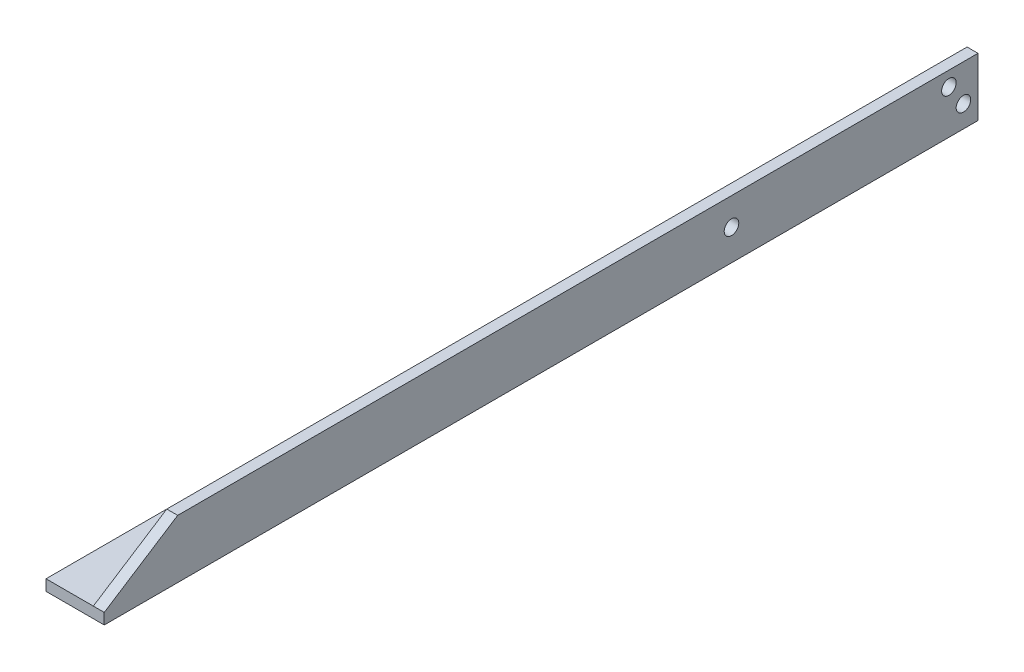
ISO-10303-21;
HEADER;
FILE_DESCRIPTION(('STEP AP214'),'2;1');
FILE_NAME('part.step','',(''),(''),'','','');
FILE_SCHEMA(('AUTOMOTIVE_DESIGN { 1 0 10303 214 1 1 1 1 }'));
ENDSEC;
DATA;
#1=APPLICATION_CONTEXT('core data for automotive mechanical design processes');
#2=APPLICATION_PROTOCOL_DEFINITION('international standard','automotive_design',2000,#1);
#3=PRODUCT_CONTEXT('',#1,'mechanical');
#4=PRODUCT('Part','Part','',(#3));
#5=PRODUCT_RELATED_PRODUCT_CATEGORY('part','',(#4));
#6=PRODUCT_DEFINITION_FORMATION('','',#4);
#7=PRODUCT_DEFINITION_CONTEXT('part definition',#1,'design');
#8=PRODUCT_DEFINITION('design','',#6,#7);
#9=PRODUCT_DEFINITION_SHAPE('','',#8);
#10=(LENGTH_UNIT() NAMED_UNIT(*) SI_UNIT(.MILLI.,.METRE.));
#11=(NAMED_UNIT(*) PLANE_ANGLE_UNIT() SI_UNIT($,.RADIAN.));
#12=(NAMED_UNIT(*) SI_UNIT($,.STERADIAN.) SOLID_ANGLE_UNIT());
#13=UNCERTAINTY_MEASURE_WITH_UNIT(LENGTH_MEASURE(1.E-05),#10,'distance_accuracy_value','');
#14=(GEOMETRIC_REPRESENTATION_CONTEXT(3) GLOBAL_UNCERTAINTY_ASSIGNED_CONTEXT((#13)) GLOBAL_UNIT_ASSIGNED_CONTEXT((#10,
#11,#12)) REPRESENTATION_CONTEXT('',''));
#15=CARTESIAN_POINT('',(0.,0.,0.));
#16=DIRECTION('',(0.,0.,1.));
#17=DIRECTION('',(1.,0.,0.));
#18=AXIS2_PLACEMENT_3D('',#15,#16,#17);
#19=CARTESIAN_POINT('',(-4.7625,0.,381.));
#20=DIRECTION('',(0.,-1.,0.));
#21=DIRECTION('',(1.,0.,0.));
#22=AXIS2_PLACEMENT_3D('',#19,#20,#21);
#23=PLANE('',#22);
#24=DIRECTION('',(0.,0.,-1.));
#25=VECTOR('',#24,1.);
#26=CARTESIAN_POINT('',(-4.7625,0.,381.));
#27=LINE('',#26,#25);
#28=CARTESIAN_POINT('',(-4.76250000000011,0.,348.973392409592));
#29=VERTEX_POINT('',#28);
#30=CARTESIAN_POINT('',(-4.7625,0.,0.));
#31=VERTEX_POINT('',#30);
#32=EDGE_CURVE('E41',#29,#31,#27,.T.);
#33=ORIENTED_EDGE('',*,*,#32,.F.);
#34=DIRECTION('',(1.,0.,0.));
#35=VECTOR('',#34,1.);
#36=CARTESIAN_POINT('',(-483.12448375289,0.,348.973392409592));
#37=LINE('',#36,#35);
#38=CARTESIAN_POINT('',(-1.11022302462516E-13,0.,348.973392409592));
#39=VERTEX_POINT('',#38);
#40=EDGE_CURVE('E96',#29,#39,#37,.T.);
#41=ORIENTED_EDGE('',*,*,#40,.T.);
#42=DIRECTION('',(0.,0.,-1.));
#43=VECTOR('',#42,1.);
#44=CARTESIAN_POINT('',(0.,0.,381.));
#45=LINE('',#44,#43);
#46=CARTESIAN_POINT('',(0.,0.,0.));
#47=VERTEX_POINT('',#46);
#48=EDGE_CURVE('E80',#39,#47,#45,.T.);
#49=ORIENTED_EDGE('',*,*,#48,.T.);
#50=DIRECTION('',(-1.,0.,0.));
#51=VECTOR('',#50,1.);
#52=CARTESIAN_POINT('',(-4.7625,0.,0.));
#53=LINE('',#52,#51);
#54=EDGE_CURVE('E110',#47,#31,#53,.T.);
#55=ORIENTED_EDGE('',*,*,#54,.T.);
#56=EDGE_LOOP('',(#33,#41,#49,#55));
#57=FACE_BOUND('',#56,.T.);
#58=ADVANCED_FACE('F33',(#57),#23,.F.);
#59=CARTESIAN_POINT('',(-4.7625,0.,381.));
#60=DIRECTION('',(1.,0.,0.));
#61=DIRECTION('',(0.,1.,0.));
#62=AXIS2_PLACEMENT_3D('',#59,#60,#61);
#63=PLANE('',#62);
#64=CARTESIAN_POINT('',(-4.7625,-11.9296158183976,107.49070151336));
#65=DIRECTION('',(1.,0.,0.));
#66=DIRECTION('',(0.,1.,0.));
#67=AXIS2_PLACEMENT_3D('',#64,#65,#66);
#68=CIRCLE('',#67,3.17499999999997);
#69=CARTESIAN_POINT('',(-4.7625,-8.7546158183976,107.49070151336));
#70=VERTEX_POINT('',#69);
#71=EDGE_CURVE('E152',#70,#70,#68,.F.);
#72=ORIENTED_EDGE('',*,*,#71,.F.);
#73=EDGE_LOOP('',(#72));
#74=FACE_BOUND('',#73,.T.);
#75=CARTESIAN_POINT('',(-4.7625,-6.35,12.7));
#76=DIRECTION('',(-1.,0.,0.));
#77=DIRECTION('',(0.,0.,1.));
#78=AXIS2_PLACEMENT_3D('',#75,#76,#77);
#79=CIRCLE('',#78,3.175);
#80=CARTESIAN_POINT('',(-4.7625,-6.35,15.875));
#81=VERTEX_POINT('',#80);
#82=EDGE_CURVE('E149',#81,#81,#79,.T.);
#83=ORIENTED_EDGE('',*,*,#82,.F.);
#84=EDGE_LOOP('',(#83));
#85=FACE_BOUND('',#84,.T.);
#86=CARTESIAN_POINT('',(-4.7625,-15.875,6.35));
#87=DIRECTION('',(-1.,0.,0.));
#88=DIRECTION('',(0.,0.,1.));
#89=AXIS2_PLACEMENT_3D('',#86,#87,#88);
#90=CIRCLE('',#89,3.175);
#91=CARTESIAN_POINT('',(-4.7625,-15.875,9.525));
#92=VERTEX_POINT('',#91);
#93=EDGE_CURVE('E143',#92,#92,#90,.T.);
#94=ORIENTED_EDGE('',*,*,#93,.F.);
#95=EDGE_LOOP('',(#94));
#96=FACE_BOUND('',#95,.T.);
#97=DIRECTION('',(0.,0.,-1.));
#98=VECTOR('',#97,1.);
#99=CARTESIAN_POINT('',(-4.7625,-20.6375,381.));
#100=LINE('',#99,#98);
#101=CARTESIAN_POINT('',(-4.7625,-20.6375,381.));
#102=VERTEX_POINT('',#101);
#103=CARTESIAN_POINT('',(-4.7625,-20.6375,0.));
#104=VERTEX_POINT('',#103);
#105=EDGE_CURVE('E108',#102,#104,#100,.T.);
#106=ORIENTED_EDGE('',*,*,#105,.F.);
#107=DIRECTION('',(0.,0.541666666666667,-0.840593375076334));
#108=VECTOR('',#107,1.);
#109=CARTESIAN_POINT('',(-4.7625,-14.5824001736111,371.603304370175));
#110=LINE('',#109,#108);
#111=EDGE_CURVE('E88',#102,#29,#110,.T.);
#112=ORIENTED_EDGE('',*,*,#111,.T.);
#113=ORIENTED_EDGE('',*,*,#32,.T.);
#114=DIRECTION('',(0.,-1.,0.));
#115=VECTOR('',#114,1.);
#116=CARTESIAN_POINT('',(-4.7625,0.,0.));
#117=LINE('',#116,#115);
#118=EDGE_CURVE('E132',#31,#104,#117,.T.);
#119=ORIENTED_EDGE('',*,*,#118,.T.);
#120=EDGE_LOOP('',(#106,#112,#113,#119));
#121=FACE_BOUND('',#120,.T.);
#122=ADVANCED_FACE('F105',(#74,#85,#96,#121),#63,.F.);
#123=CARTESIAN_POINT('',(-4.7625,-20.6375,381.));
#124=DIRECTION('',(0.,-1.,0.));
#125=DIRECTION('',(1.,0.,0.));
#126=AXIS2_PLACEMENT_3D('',#123,#124,#125);
#127=PLANE('',#126);
#128=CARTESIAN_POINT('',(-15.08125,-20.6375,12.7));
#129=DIRECTION('',(0.,1.,0.));
#130=DIRECTION('',(-1.,0.,0.));
#131=AXIS2_PLACEMENT_3D('',#128,#129,#130);
#132=CIRCLE('',#131,3.175);
#133=CARTESIAN_POINT('',(-18.25625,-20.6375,12.7));
#134=VERTEX_POINT('',#133);
#135=EDGE_CURVE('E161',#134,#134,#132,.T.);
#136=ORIENTED_EDGE('',*,*,#135,.F.);
#137=EDGE_LOOP('',(#136));
#138=FACE_BOUND('',#137,.T.);
#139=DIRECTION('',(-1.,0.,0.));
#140=VECTOR('',#139,1.);
#141=CARTESIAN_POINT('',(-4.7625,-20.6375,0.));
#142=LINE('',#141,#140);
#143=CARTESIAN_POINT('',(-25.4,-20.6375,0.));
#144=VERTEX_POINT('',#143);
#145=EDGE_CURVE('E130',#104,#144,#142,.T.);
#146=ORIENTED_EDGE('',*,*,#145,.T.);
#147=DIRECTION('',(0.,0.,-1.));
#148=VECTOR('',#147,1.);
#149=CARTESIAN_POINT('',(-25.4,-20.6375,381.));
#150=LINE('',#149,#148);
#151=CARTESIAN_POINT('',(-25.4,-20.6375,381.));
#152=VERTEX_POINT('',#151);
#153=EDGE_CURVE('E113',#152,#144,#150,.T.);
#154=ORIENTED_EDGE('',*,*,#153,.F.);
#155=DIRECTION('',(-1.,0.,0.));
#156=VECTOR('',#155,1.);
#157=CARTESIAN_POINT('',(-4.7625,-20.6375,381.));
#158=LINE('',#157,#156);
#159=EDGE_CURVE('E126',#102,#152,#158,.T.);
#160=ORIENTED_EDGE('',*,*,#159,.F.);
#161=ORIENTED_EDGE('',*,*,#105,.T.);
#162=EDGE_LOOP('',(#146,#154,#160,#161));
#163=FACE_BOUND('',#162,.T.);
#164=ADVANCED_FACE('F168',(#138,#163),#127,.F.);
#165=CARTESIAN_POINT('',(-25.4,-25.4,381.));
#166=DIRECTION('',(1.,0.,0.));
#167=DIRECTION('',(0.,0.,-1.));
#168=AXIS2_PLACEMENT_3D('',#165,#166,#167);
#169=PLANE('',#168);
#170=DIRECTION('',(0.,-1.,0.));
#171=VECTOR('',#170,1.);
#172=CARTESIAN_POINT('',(-25.4,-25.4,0.));
#173=LINE('',#172,#171);
#174=CARTESIAN_POINT('',(-25.4,-25.4,0.));
#175=VERTEX_POINT('',#174);
#176=EDGE_CURVE('E128',#144,#175,#173,.T.);
#177=ORIENTED_EDGE('',*,*,#176,.T.);
#178=DIRECTION('',(0.,0.,-1.));
#179=VECTOR('',#178,1.);
#180=CARTESIAN_POINT('',(-25.4,-25.4,381.));
#181=LINE('',#180,#179);
#182=CARTESIAN_POINT('',(-25.4,-25.4,381.));
#183=VERTEX_POINT('',#182);
#184=EDGE_CURVE('E118',#183,#175,#181,.T.);
#185=ORIENTED_EDGE('',*,*,#184,.F.);
#186=DIRECTION('',(0.,-1.,0.));
#187=VECTOR('',#186,1.);
#188=CARTESIAN_POINT('',(-25.4,-25.4,381.));
#189=LINE('',#188,#187);
#190=EDGE_CURVE('E137',#152,#183,#189,.T.);
#191=ORIENTED_EDGE('',*,*,#190,.F.);
#192=ORIENTED_EDGE('',*,*,#153,.T.);
#193=EDGE_LOOP('',(#177,#185,#191,#192));
#194=FACE_BOUND('',#193,.T.);
#195=ADVANCED_FACE('F171',(#194),#169,.F.);
#196=CARTESIAN_POINT('',(0.,-25.4,381.));
#197=DIRECTION('',(0.,1.,0.));
#198=DIRECTION('',(-1.,0.,0.));
#199=AXIS2_PLACEMENT_3D('',#196,#197,#198);
#200=PLANE('',#199);
#201=CARTESIAN_POINT('',(-15.08125,-25.4,12.7));
#202=DIRECTION('',(0.,1.,0.));
#203=DIRECTION('',(-1.,0.,0.));
#204=AXIS2_PLACEMENT_3D('',#201,#202,#203);
#205=CIRCLE('',#204,3.175);
#206=CARTESIAN_POINT('',(-18.25625,-25.4,12.7));
#207=VERTEX_POINT('',#206);
#208=EDGE_CURVE('E158',#207,#207,#205,.F.);
#209=ORIENTED_EDGE('',*,*,#208,.F.);
#210=EDGE_LOOP('',(#209));
#211=FACE_BOUND('',#210,.T.);
#212=DIRECTION('',(1.,0.,0.));
#213=VECTOR('',#212,1.);
#214=CARTESIAN_POINT('',(0.,-25.4,0.));
#215=LINE('',#214,#213);
#216=CARTESIAN_POINT('',(0.,-25.4,0.));
#217=VERTEX_POINT('',#216);
#218=EDGE_CURVE('E72',#175,#217,#215,.T.);
#219=ORIENTED_EDGE('',*,*,#218,.T.);
#220=DIRECTION('',(0.,0.,-1.));
#221=VECTOR('',#220,1.);
#222=CARTESIAN_POINT('',(0.,-25.4,381.));
#223=LINE('',#222,#221);
#224=CARTESIAN_POINT('',(0.,-25.4,381.));
#225=VERTEX_POINT('',#224);
#226=EDGE_CURVE('E120',#225,#217,#223,.T.);
#227=ORIENTED_EDGE('',*,*,#226,.F.);
#228=DIRECTION('',(1.,0.,0.));
#229=VECTOR('',#228,1.);
#230=CARTESIAN_POINT('',(0.,-25.4,381.));
#231=LINE('',#230,#229);
#232=EDGE_CURVE('E49',#183,#225,#231,.T.);
#233=ORIENTED_EDGE('',*,*,#232,.F.);
#234=ORIENTED_EDGE('',*,*,#184,.T.);
#235=EDGE_LOOP('',(#219,#227,#233,#234));
#236=FACE_BOUND('',#235,.T.);
#237=ADVANCED_FACE('F185',(#211,#236),#200,.F.);
#238=CARTESIAN_POINT('',(0.,0.,381.));
#239=DIRECTION('',(-1.,0.,0.));
#240=DIRECTION('',(0.,-1.,0.));
#241=AXIS2_PLACEMENT_3D('',#238,#239,#240);
#242=PLANE('',#241);
#243=CARTESIAN_POINT('',(0.,-11.9296158183976,107.49070151336));
#244=DIRECTION('',(1.,0.,0.));
#245=DIRECTION('',(0.,1.,0.));
#246=AXIS2_PLACEMENT_3D('',#243,#244,#245);
#247=CIRCLE('',#246,3.17499999999997);
#248=CARTESIAN_POINT('',(0.,-8.7546158183976,107.49070151336));
#249=VERTEX_POINT('',#248);
#250=EDGE_CURVE('E155',#249,#249,#247,.T.);
#251=ORIENTED_EDGE('',*,*,#250,.F.);
#252=EDGE_LOOP('',(#251));
#253=FACE_BOUND('',#252,.T.);
#254=CARTESIAN_POINT('',(0.,-6.35,12.7));
#255=DIRECTION('',(-1.,0.,0.));
#256=DIRECTION('',(0.,-1.,0.));
#257=AXIS2_PLACEMENT_3D('',#254,#255,#256);
#258=CIRCLE('',#257,3.175);
#259=CARTESIAN_POINT('',(0.,-9.525,12.7));
#260=VERTEX_POINT('',#259);
#261=EDGE_CURVE('E146',#260,#260,#258,.F.);
#262=ORIENTED_EDGE('',*,*,#261,.F.);
#263=EDGE_LOOP('',(#262));
#264=FACE_BOUND('',#263,.T.);
#265=CARTESIAN_POINT('',(0.,-15.875,6.35));
#266=DIRECTION('',(-1.,0.,0.));
#267=DIRECTION('',(0.,-1.,0.));
#268=AXIS2_PLACEMENT_3D('',#265,#266,#267);
#269=CIRCLE('',#268,3.175);
#270=CARTESIAN_POINT('',(0.,-19.05,6.35));
#271=VERTEX_POINT('',#270);
#272=EDGE_CURVE('E101',#271,#271,#269,.F.);
#273=ORIENTED_EDGE('',*,*,#272,.F.);
#274=EDGE_LOOP('',(#273));
#275=FACE_BOUND('',#274,.T.);
#276=ORIENTED_EDGE('',*,*,#48,.F.);
#277=DIRECTION('',(0.,-0.541666666666667,0.840593375076334));
#278=VECTOR('',#277,1.);
#279=CARTESIAN_POINT('',(0.,-14.5824001736111,371.603304370175));
#280=LINE('',#279,#278);
#281=CARTESIAN_POINT('',(-1.11022302462516E-13,-20.6375,381.));
#282=VERTEX_POINT('',#281);
#283=EDGE_CURVE('E99',#39,#282,#280,.T.);
#284=ORIENTED_EDGE('',*,*,#283,.T.);
#285=DIRECTION('',(0.,1.,0.));
#286=VECTOR('',#285,1.);
#287=CARTESIAN_POINT('',(0.,0.,381.));
#288=LINE('',#287,#286);
#289=EDGE_CURVE('E123',#225,#282,#288,.T.);
#290=ORIENTED_EDGE('',*,*,#289,.F.);
#291=ORIENTED_EDGE('',*,*,#226,.T.);
#292=DIRECTION('',(0.,1.,0.));
#293=VECTOR('',#292,1.);
#294=CARTESIAN_POINT('',(0.,0.,0.));
#295=LINE('',#294,#293);
#296=EDGE_CURVE('E124',#217,#47,#295,.T.);
#297=ORIENTED_EDGE('',*,*,#296,.T.);
#298=EDGE_LOOP('',(#276,#284,#290,#291,#297));
#299=FACE_BOUND('',#298,.T.);
#300=ADVANCED_FACE('F183',(#253,#264,#275,#299),#242,.F.);
#301=CARTESIAN_POINT('',(0.,0.,381.));
#302=DIRECTION('',(0.,0.,-1.));
#303=DIRECTION('',(-1.,0.,0.));
#304=AXIS2_PLACEMENT_3D('',#301,#302,#303);
#305=PLANE('',#304);
#306=ORIENTED_EDGE('',*,*,#289,.T.);
#307=DIRECTION('',(-1.,0.,0.));
#308=VECTOR('',#307,1.);
#309=CARTESIAN_POINT('',(0.,-20.6375,381.));
#310=LINE('',#309,#308);
#311=EDGE_CURVE('E11',#282,#102,#310,.T.);
#312=ORIENTED_EDGE('',*,*,#311,.T.);
#313=ORIENTED_EDGE('',*,*,#159,.T.);
#314=ORIENTED_EDGE('',*,*,#190,.T.);
#315=ORIENTED_EDGE('',*,*,#232,.T.);
#316=EDGE_LOOP('',(#306,#312,#313,#314,#315));
#317=FACE_BOUND('',#316,.T.);
#318=ADVANCED_FACE('F193',(#317),#305,.F.);
#319=CARTESIAN_POINT('',(0.,0.,0.));
#320=DIRECTION('',(0.,0.,-1.));
#321=DIRECTION('',(-1.,0.,0.));
#322=AXIS2_PLACEMENT_3D('',#319,#320,#321);
#323=PLANE('',#322);
#324=ORIENTED_EDGE('',*,*,#54,.F.);
#325=ORIENTED_EDGE('',*,*,#296,.F.);
#326=ORIENTED_EDGE('',*,*,#218,.F.);
#327=ORIENTED_EDGE('',*,*,#176,.F.);
#328=ORIENTED_EDGE('',*,*,#145,.F.);
#329=ORIENTED_EDGE('',*,*,#118,.F.);
#330=EDGE_LOOP('',(#324,#325,#326,#327,#328,#329));
#331=FACE_BOUND('',#330,.T.);
#332=ADVANCED_FACE('F180',(#331),#323,.T.);
#333=CARTESIAN_POINT('',(-483.12448375289,-20.6375,381.));
#334=DIRECTION('',(0.,-0.840593375076334,-0.541666666666667));
#335=DIRECTION('',(0.,0.541666666666667,-0.840593375076334));
#336=AXIS2_PLACEMENT_3D('',#333,#334,#335);
#337=PLANE('',#336);
#338=ORIENTED_EDGE('',*,*,#111,.F.);
#339=ORIENTED_EDGE('',*,*,#311,.F.);
#340=ORIENTED_EDGE('',*,*,#283,.F.);
#341=ORIENTED_EDGE('',*,*,#40,.F.);
#342=EDGE_LOOP('',(#338,#339,#340,#341));
#343=FACE_BOUND('',#342,.T.);
#344=ADVANCED_FACE('F97',(#343),#337,.F.);
#345=CARTESIAN_POINT('',(0.00100000000000273,-15.875,6.35));
#346=DIRECTION('',(-1.,0.,0.));
#347=DIRECTION('',(0.,0.,1.));
#348=AXIS2_PLACEMENT_3D('',#345,#346,#347);
#349=CYLINDRICAL_SURFACE('',#348,3.175);
#350=ORIENTED_EDGE('',*,*,#93,.T.);
#351=EDGE_LOOP('',(#350));
#352=FACE_BOUND('',#351,.T.);
#353=ORIENTED_EDGE('',*,*,#272,.T.);
#354=EDGE_LOOP('',(#353));
#355=FACE_BOUND('',#354,.T.);
#356=ADVANCED_FACE('F211',(#352,#355),#349,.F.);
#357=CARTESIAN_POINT('',(0.00100000000000273,-6.35,12.7));
#358=DIRECTION('',(-1.,0.,0.));
#359=DIRECTION('',(0.,0.,1.));
#360=AXIS2_PLACEMENT_3D('',#357,#358,#359);
#361=CYLINDRICAL_SURFACE('',#360,3.175);
#362=ORIENTED_EDGE('',*,*,#82,.T.);
#363=EDGE_LOOP('',(#362));
#364=FACE_BOUND('',#363,.T.);
#365=ORIENTED_EDGE('',*,*,#261,.T.);
#366=EDGE_LOOP('',(#365));
#367=FACE_BOUND('',#366,.T.);
#368=ADVANCED_FACE('F214',(#364,#367),#361,.F.);
#369=CARTESIAN_POINT('',(-25.401,-11.9296158183976,107.49070151336));
#370=DIRECTION('',(1.,0.,0.));
#371=DIRECTION('',(0.,1.,0.));
#372=AXIS2_PLACEMENT_3D('',#369,#370,#371);
#373=CYLINDRICAL_SURFACE('',#372,3.17499999999997);
#374=CARTESIAN_POINT('',(0.,-8.7546158183976,107.49070151336));
#375=CARTESIAN_POINT('',(-0.0496093749999966,-8.7546158183976,107.49070151336));
#376=CARTESIAN_POINT('',(-0.0992187499999966,-8.7546158183976,107.49070151336));
#377=CARTESIAN_POINT('',(-0.198437499999997,-8.7546158183976,107.49070151336));
#378=CARTESIAN_POINT('',(-0.248046874999997,-8.7546158183976,107.49070151336));
#379=CARTESIAN_POINT('',(-0.347265624999997,-8.7546158183976,107.49070151336));
#380=CARTESIAN_POINT('',(-0.396874999999997,-8.7546158183976,107.49070151336));
#381=CARTESIAN_POINT('',(-0.496093749999997,-8.7546158183976,107.49070151336));
#382=CARTESIAN_POINT('',(-0.545703124999997,-8.7546158183976,107.49070151336));
#383=CARTESIAN_POINT('',(-0.644921874999997,-8.7546158183976,107.49070151336));
#384=CARTESIAN_POINT('',(-0.694531249999997,-8.7546158183976,107.49070151336));
#385=CARTESIAN_POINT('',(-0.793749999999997,-8.7546158183976,107.49070151336));
#386=CARTESIAN_POINT('',(-0.843359374999997,-8.7546158183976,107.49070151336));
#387=CARTESIAN_POINT('',(-0.942578124999997,-8.7546158183976,107.49070151336));
#388=CARTESIAN_POINT('',(-0.992187499999997,-8.7546158183976,107.49070151336));
#389=CARTESIAN_POINT('',(-1.09140625,-8.7546158183976,107.49070151336));
#390=CARTESIAN_POINT('',(-1.141015625,-8.7546158183976,107.49070151336));
#391=CARTESIAN_POINT('',(-1.240234375,-8.7546158183976,107.49070151336));
#392=CARTESIAN_POINT('',(-1.28984375,-8.7546158183976,107.49070151336));
#393=CARTESIAN_POINT('',(-1.3890625,-8.7546158183976,107.49070151336));
#394=CARTESIAN_POINT('',(-1.438671875,-8.7546158183976,107.49070151336));
#395=CARTESIAN_POINT('',(-1.537890625,-8.7546158183976,107.49070151336));
#396=CARTESIAN_POINT('',(-1.5875,-8.7546158183976,107.49070151336));
#397=CARTESIAN_POINT('',(-1.68671875,-8.7546158183976,107.49070151336));
#398=CARTESIAN_POINT('',(-1.736328125,-8.7546158183976,107.49070151336));
#399=CARTESIAN_POINT('',(-1.835546875,-8.7546158183976,107.49070151336));
#400=CARTESIAN_POINT('',(-1.88515625,-8.7546158183976,107.49070151336));
#401=CARTESIAN_POINT('',(-1.984375,-8.7546158183976,107.49070151336));
#402=CARTESIAN_POINT('',(-2.033984375,-8.7546158183976,107.49070151336));
#403=CARTESIAN_POINT('',(-2.133203125,-8.7546158183976,107.49070151336));
#404=CARTESIAN_POINT('',(-2.1828125,-8.7546158183976,107.49070151336));
#405=CARTESIAN_POINT('',(-2.28203125,-8.7546158183976,107.49070151336));
#406=CARTESIAN_POINT('',(-2.331640625,-8.7546158183976,107.49070151336));
#407=CARTESIAN_POINT('',(-2.430859375,-8.7546158183976,107.49070151336));
#408=CARTESIAN_POINT('',(-2.48046875,-8.7546158183976,107.49070151336));
#409=CARTESIAN_POINT('',(-2.5796875,-8.7546158183976,107.49070151336));
#410=CARTESIAN_POINT('',(-2.629296875,-8.7546158183976,107.49070151336));
#411=CARTESIAN_POINT('',(-2.728515625,-8.7546158183976,107.49070151336));
#412=CARTESIAN_POINT('',(-2.778125,-8.7546158183976,107.49070151336));
#413=CARTESIAN_POINT('',(-2.87734375,-8.7546158183976,107.49070151336));
#414=CARTESIAN_POINT('',(-2.926953125,-8.7546158183976,107.49070151336));
#415=CARTESIAN_POINT('',(-3.026171875,-8.7546158183976,107.49070151336));
#416=CARTESIAN_POINT('',(-3.07578125,-8.7546158183976,107.49070151336));
#417=CARTESIAN_POINT('',(-3.175,-8.7546158183976,107.49070151336));
#418=CARTESIAN_POINT('',(-3.224609375,-8.7546158183976,107.49070151336));
#419=CARTESIAN_POINT('',(-3.323828125,-8.7546158183976,107.49070151336));
#420=CARTESIAN_POINT('',(-3.3734375,-8.7546158183976,107.49070151336));
#421=CARTESIAN_POINT('',(-3.47265625,-8.7546158183976,107.49070151336));
#422=CARTESIAN_POINT('',(-3.522265625,-8.7546158183976,107.49070151336));
#423=CARTESIAN_POINT('',(-3.621484375,-8.7546158183976,107.49070151336));
#424=CARTESIAN_POINT('',(-3.67109375,-8.7546158183976,107.49070151336));
#425=CARTESIAN_POINT('',(-3.7703125,-8.7546158183976,107.49070151336));
#426=CARTESIAN_POINT('',(-3.819921875,-8.7546158183976,107.49070151336));
#427=CARTESIAN_POINT('',(-3.919140625,-8.7546158183976,107.49070151336));
#428=CARTESIAN_POINT('',(-3.96875,-8.7546158183976,107.49070151336));
#429=CARTESIAN_POINT('',(-4.06796875,-8.7546158183976,107.49070151336));
#430=CARTESIAN_POINT('',(-4.117578125,-8.7546158183976,107.49070151336));
#431=CARTESIAN_POINT('',(-4.216796875,-8.7546158183976,107.49070151336));
#432=CARTESIAN_POINT('',(-4.26640625,-8.7546158183976,107.49070151336));
#433=CARTESIAN_POINT('',(-4.365625,-8.7546158183976,107.49070151336));
#434=CARTESIAN_POINT('',(-4.415234375,-8.7546158183976,107.49070151336));
#435=CARTESIAN_POINT('',(-4.514453125,-8.7546158183976,107.49070151336));
#436=CARTESIAN_POINT('',(-4.5640625,-8.7546158183976,107.49070151336));
#437=CARTESIAN_POINT('',(-4.66328125,-8.7546158183976,107.49070151336));
#438=CARTESIAN_POINT('',(-4.712890625,-8.7546158183976,107.49070151336));
#439=CARTESIAN_POINT('',(-4.7625,-8.7546158183976,107.49070151336));
#440=B_SPLINE_CURVE_WITH_KNOTS('',3,(#374,#375,#376,#377,#378,#379,#380,#381,#382,#383,#384,
#385,#386,#387,#388,#389,#390,#391,#392,#393,#394,#395,#396,#397,#398,#399,#400,#401,#402,#403,
#404,#405,#406,#407,#408,#409,#410,#411,#412,#413,#414,#415,#416,#417,#418,#419,#420,#421,#422,
#423,#424,#425,#426,#427,#428,#429,#430,#431,#432,#433,#434,#435,#436,#437,#438,#439),
.UNSPECIFIED.,.F.,.F.,(4,2,2,2,2,2,2,2,2,2,2,2,2,2,2,2,2,2,2,2,2,2,2,2,2,2,2,2,2,2,2,2,4),(0.,
0.148828125,0.29765625,0.446484375,0.5953125,0.744140625,0.892968750000001,1.041796875,1.190625,
1.339453125,1.48828125,1.637109375,1.7859375,1.934765625,2.08359375,2.232421875,2.38125,
2.530078125,2.67890625,2.827734375,2.9765625,3.125390625,3.27421875,3.423046875,3.571875,
3.720703125,3.86953125,4.018359375,4.1671875,4.316015625,4.46484375,4.613671875,4.7625),.UNSPECIFIED.);
#441=EDGE_CURVE('BSEAM222',#249,#70,#440,.T.);
#442=ORIENTED_EDGE('',*,*,#250,.T.);
#443=ORIENTED_EDGE('',*,*,#71,.T.);
#444=ORIENTED_EDGE('',*,*,#441,.T.);
#445=ORIENTED_EDGE('',*,*,#441,.F.);
#446=EDGE_LOOP('',(#442,#444,#443,#445));
#447=FACE_BOUND('',#446,.T.);
#448=ADVANCED_FACE('F222',(#447),#373,.F.);
#449=CARTESIAN_POINT('',(-15.08125,-25.401,12.7));
#450=DIRECTION('',(0.,1.,0.));
#451=DIRECTION('',(-1.,0.,0.));
#452=AXIS2_PLACEMENT_3D('',#449,#450,#451);
#453=CYLINDRICAL_SURFACE('',#452,3.175);
#454=ORIENTED_EDGE('',*,*,#135,.T.);
#455=EDGE_LOOP('',(#454));
#456=FACE_BOUND('',#455,.T.);
#457=ORIENTED_EDGE('',*,*,#208,.T.);
#458=EDGE_LOOP('',(#457));
#459=FACE_BOUND('',#458,.T.);
#460=ADVANCED_FACE('F165',(#456,#459),#453,.F.);
#461=CLOSED_SHELL('',(#58,#122,#164,#195,#237,#300,#318,#332,#344,#356,#368,#448,#460));
#462=MANIFOLD_SOLID_BREP('B2',#461);
#463=ADVANCED_BREP_SHAPE_REPRESENTATION('',(#18,#462),#14);
#464=SHAPE_DEFINITION_REPRESENTATION(#9,#463);
ENDSEC;
END-ISO-10303-21;
